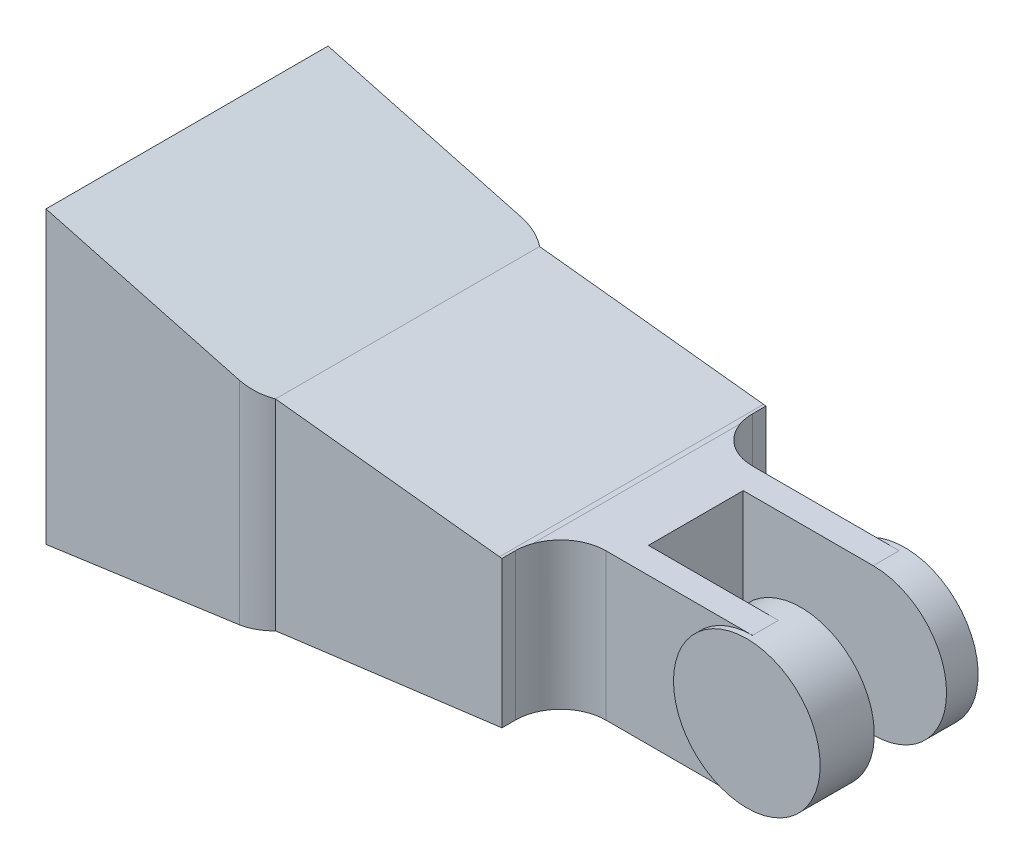
ISO-10303-21;
HEADER;
FILE_DESCRIPTION(('STEP AP214'),'2;1');
FILE_NAME('part.step','',(''),(''),'','','');
FILE_SCHEMA(('AUTOMOTIVE_DESIGN { 1 0 10303 214 1 1 1 1 }'));
ENDSEC;
DATA;
#1=APPLICATION_CONTEXT('core data for automotive mechanical design processes');
#2=APPLICATION_PROTOCOL_DEFINITION('international standard','automotive_design',2000,#1);
#3=PRODUCT_CONTEXT('',#1,'mechanical');
#4=PRODUCT('Part','Part','',(#3));
#5=PRODUCT_RELATED_PRODUCT_CATEGORY('part','',(#4));
#6=PRODUCT_DEFINITION_FORMATION('','',#4);
#7=PRODUCT_DEFINITION_CONTEXT('part definition',#1,'design');
#8=PRODUCT_DEFINITION('design','',#6,#7);
#9=PRODUCT_DEFINITION_SHAPE('','',#8);
#10=(LENGTH_UNIT() NAMED_UNIT(*) SI_UNIT(.MILLI.,.METRE.));
#11=(NAMED_UNIT(*) PLANE_ANGLE_UNIT() SI_UNIT($,.RADIAN.));
#12=(NAMED_UNIT(*) SI_UNIT($,.STERADIAN.) SOLID_ANGLE_UNIT());
#13=UNCERTAINTY_MEASURE_WITH_UNIT(LENGTH_MEASURE(1.E-05),#10,'distance_accuracy_value','');
#14=(GEOMETRIC_REPRESENTATION_CONTEXT(3) GLOBAL_UNCERTAINTY_ASSIGNED_CONTEXT((#13)) GLOBAL_UNIT_ASSIGNED_CONTEXT((#10,
#11,#12)) REPRESENTATION_CONTEXT('',''));
#15=CARTESIAN_POINT('',(0.,0.,0.));
#16=DIRECTION('',(0.,0.,1.));
#17=DIRECTION('',(1.,0.,0.));
#18=AXIS2_PLACEMENT_3D('',#15,#16,#17);
#19=CARTESIAN_POINT('',(782.433555688599,-126.351294856584,42.));
#20=DIRECTION('',(0.,0.,1.));
#21=DIRECTION('',(1.,0.,0.));
#22=AXIS2_PLACEMENT_3D('',#19,#20,#21);
#23=PLANE('',#22);
#24=CARTESIAN_POINT('',(566.102847064658,-21.3512948565843,42.));
#25=DIRECTION('',(0.,0.,1.));
#26=DIRECTION('',(1.,0.,0.));
#27=AXIS2_PLACEMENT_3D('',#24,#25,#26);
#28=CIRCLE('',#27,65.);
#29=CARTESIAN_POINT('',(566.102847064658,-86.3512948565843,42.));
#30=VERTEX_POINT('',#29);
#31=CARTESIAN_POINT('',(566.102847064658,43.6487051434157,42.));
#32=VERTEX_POINT('',#31);
#33=EDGE_CURVE('E11',#30,#32,#28,.F.);
#34=ORIENTED_EDGE('',*,*,#33,.F.);
#35=DIRECTION('',(1.,0.,0.));
#36=VECTOR('',#35,1.);
#37=CARTESIAN_POINT('',(566.102847064658,-86.3512948565843,42.));
#38=LINE('',#37,#36);
#39=CARTESIAN_POINT('',(450.918960223876,-86.3512948565843,42.));
#40=VERTEX_POINT('',#39);
#41=EDGE_CURVE('E177',#40,#30,#38,.T.);
#42=ORIENTED_EDGE('',*,*,#41,.F.);
#43=DIRECTION('',(0.,1.,0.));
#44=VECTOR('',#43,1.);
#45=CARTESIAN_POINT('',(450.918960223876,-126.351294856584,42.));
#46=LINE('',#45,#44);
#47=CARTESIAN_POINT('',(450.918960223876,43.6487051434157,42.));
#48=VERTEX_POINT('',#47);
#49=EDGE_CURVE('E459',#40,#48,#46,.T.);
#50=ORIENTED_EDGE('',*,*,#49,.T.);
#51=DIRECTION('',(1.,0.,0.));
#52=VECTOR('',#51,1.);
#53=CARTESIAN_POINT('',(782.433555688599,43.6487051434157,42.));
#54=LINE('',#53,#52);
#55=EDGE_CURVE('E180',#48,#32,#54,.T.);
#56=ORIENTED_EDGE('',*,*,#55,.T.);
#57=EDGE_LOOP('',(#34,#42,#50,#56));
#58=FACE_BOUND('',#57,.T.);
#59=ADVANCED_FACE('F38',(#58),#23,.F.);
#60=CARTESIAN_POINT('',(566.102847064658,-21.3512948565843,65.));
#61=DIRECTION('',(0.,0.,-1.));
#62=DIRECTION('',(-1.,0.,0.));
#63=AXIS2_PLACEMENT_3D('',#60,#61,#62);
#64=CYLINDRICAL_SURFACE('',#63,65.);
#65=DIRECTION('',(0.,0.,-1.));
#66=VECTOR('',#65,1.);
#67=CARTESIAN_POINT('',(566.102847064658,-86.3512948565842,65.));
#68=LINE('',#67,#66);
#69=CARTESIAN_POINT('',(566.102847064658,-86.3512948565843,65.));
#70=VERTEX_POINT('',#69);
#71=EDGE_CURVE('E189',#70,#30,#68,.T.);
#72=ORIENTED_EDGE('',*,*,#71,.T.);
#73=ORIENTED_EDGE('',*,*,#33,.T.);
#74=DIRECTION('',(0.,0.,-1.));
#75=VECTOR('',#74,1.);
#76=CARTESIAN_POINT('',(566.102847064658,43.6487051434157,65.));
#77=LINE('',#76,#75);
#78=CARTESIAN_POINT('',(566.102847064658,43.6487051434157,65.));
#79=VERTEX_POINT('',#78);
#80=EDGE_CURVE('E204',#79,#32,#77,.T.);
#81=ORIENTED_EDGE('',*,*,#80,.F.);
#82=CARTESIAN_POINT('',(566.102847064658,-21.3512948565843,65.));
#83=DIRECTION('',(0.,0.,1.));
#84=DIRECTION('',(1.,0.,0.));
#85=AXIS2_PLACEMENT_3D('',#82,#83,#84);
#86=CIRCLE('',#85,65.);
#87=EDGE_CURVE('E198',#79,#70,#86,.T.);
#88=ORIENTED_EDGE('',*,*,#87,.T.);
#89=EDGE_LOOP('',(#72,#73,#81,#88));
#90=FACE_BOUND('',#89,.T.);
#91=CARTESIAN_POINT('',(566.102847064658,-21.3512948565843,70.));
#92=DIRECTION('',(0.,0.,1.));
#93=DIRECTION('',(1.,0.,0.));
#94=AXIS2_PLACEMENT_3D('',#91,#92,#93);
#95=CIRCLE('',#94,65.);
#96=CARTESIAN_POINT('',(631.102847064658,-21.3512948565843,70.));
#97=VERTEX_POINT('',#96);
#98=EDGE_CURVE('E467',#97,#97,#95,.T.);
#99=ORIENTED_EDGE('',*,*,#98,.F.);
#100=EDGE_LOOP('',(#99));
#101=FACE_BOUND('',#100,.T.);
#102=CARTESIAN_POINT('',(566.102847064658,-21.3512948565843,22.));
#103=DIRECTION('',(0.,0.,-1.));
#104=DIRECTION('',(-1.,0.,0.));
#105=AXIS2_PLACEMENT_3D('',#102,#103,#104);
#106=CIRCLE('',#105,65.);
#107=CARTESIAN_POINT('',(501.102847064658,-21.3512948565843,22.));
#108=VERTEX_POINT('',#107);
#109=EDGE_CURVE('E474',#108,#108,#106,.T.);
#110=ORIENTED_EDGE('',*,*,#109,.F.);
#111=EDGE_LOOP('',(#110));
#112=FACE_BOUND('',#111,.T.);
#113=ADVANCED_FACE('F196',(#90,#101,#112),#64,.T.);
#114=CARTESIAN_POINT('',(396.102847064658,43.6487051434157,117.));
#115=DIRECTION('',(-1.,0.,0.));
#116=DIRECTION('',(0.,0.,1.));
#117=AXIS2_PLACEMENT_3D('',#114,#115,#116);
#118=PLANE('',#117);
#119=DIRECTION('',(0.,0.,-1.));
#120=VECTOR('',#119,1.);
#121=CARTESIAN_POINT('',(396.102847064658,-86.3512948565843,117.));
#122=LINE('',#121,#120);
#123=CARTESIAN_POINT('',(396.102847064658,-86.3512948565843,117.));
#124=VERTEX_POINT('',#123);
#125=CARTESIAN_POINT('',(396.102847064658,-86.3512948565843,105.));
#126=VERTEX_POINT('',#125);
#127=EDGE_CURVE('E230',#124,#126,#122,.T.);
#128=ORIENTED_EDGE('',*,*,#127,.T.);
#129=DIRECTION('',(0.,-1.,0.));
#130=VECTOR('',#129,1.);
#131=CARTESIAN_POINT('',(396.102847064658,43.6487051434157,105.));
#132=LINE('',#131,#130);
#133=CARTESIAN_POINT('',(396.102847064658,43.709091576023,105.));
#134=VERTEX_POINT('',#133);
#135=EDGE_CURVE('E281',#126,#134,#132,.F.);
#136=ORIENTED_EDGE('',*,*,#135,.T.);
#137=DIRECTION('',(0.,0.,1.));
#138=VECTOR('',#137,1.);
#139=CARTESIAN_POINT('',(396.102847064658,43.709091576023,105.));
#140=LINE('',#139,#138);
#141=CARTESIAN_POINT('',(396.102847064658,43.709091576023,117.));
#142=VERTEX_POINT('',#141);
#143=EDGE_CURVE('E289',#134,#142,#140,.T.);
#144=ORIENTED_EDGE('',*,*,#143,.T.);
#145=DIRECTION('',(0.,1.,0.));
#146=VECTOR('',#145,1.);
#147=CARTESIAN_POINT('',(396.102847064658,43.6487051434157,117.));
#148=LINE('',#147,#146);
#149=EDGE_CURVE('E214',#124,#142,#148,.T.);
#150=ORIENTED_EDGE('',*,*,#149,.F.);
#151=EDGE_LOOP('',(#128,#136,#144,#150));
#152=FACE_BOUND('',#151,.T.);
#153=ADVANCED_FACE('F339',(#152),#118,.F.);
#154=CARTESIAN_POINT('',(195.420455752212,65.7614292035398,125.));
#155=DIRECTION('',(-0.257950706385254,-0.966158078719703,0.));
#156=DIRECTION('',(0.966158078719703,-0.257950706385254,0.));
#157=AXIS2_PLACEMENT_3D('',#154,#155,#156);
#158=PLANE('',#157);
#159=DIRECTION('',(0.,0.,-1.));
#160=VECTOR('',#159,1.);
#161=CARTESIAN_POINT('',(195.420455752212,65.7614292035398,117.));
#162=LINE('',#161,#160);
#163=CARTESIAN_POINT('',(195.420455752212,65.7614292035398,117.));
#164=VERTEX_POINT('',#163);
#165=CARTESIAN_POINT('',(195.420455752212,65.7614292035398,-117.));
#166=VERTEX_POINT('',#165);
#167=EDGE_CURVE('E218',#164,#166,#162,.T.);
#168=ORIENTED_EDGE('',*,*,#167,.T.);
#169=CARTESIAN_POINT('',(171.420455752212,72.1690938389686,-85.));
#170=DIRECTION('',(-0.257950706385254,-0.966158078719703,0.));
#171=DIRECTION('',(0.966158078719703,-0.257950706385254,0.));
#172=AXIS2_PLACEMENT_3D('',#169,#170,#171);
#173=ELLIPSE('',#172,41.4010925137692,40.);
#174=CARTESIAN_POINT('',(171.420455752212,72.1690938389686,-125.));
#175=VERTEX_POINT('',#174);
#176=EDGE_CURVE('E258',#166,#175,#173,.F.);
#177=ORIENTED_EDGE('',*,*,#176,.T.);
#178=DIRECTION('',(-0.966158078719703,0.257950706385254,0.));
#179=VECTOR('',#178,1.);
#180=CARTESIAN_POINT('',(195.420455752212,65.7614292035398,-125.));
#181=LINE('',#180,#179);
#182=CARTESIAN_POINT('',(0.,117.935960176991,-125.));
#183=VERTEX_POINT('',#182);
#184=EDGE_CURVE('E235',#175,#183,#181,.T.);
#185=ORIENTED_EDGE('',*,*,#184,.T.);
#186=DIRECTION('',(0.,0.,-1.));
#187=VECTOR('',#186,1.);
#188=CARTESIAN_POINT('',(0.,117.935960176991,125.));
#189=LINE('',#188,#187);
#190=CARTESIAN_POINT('',(0.,117.935960176991,125.));
#191=VERTEX_POINT('',#190);
#192=EDGE_CURVE('E252',#191,#183,#189,.T.);
#193=ORIENTED_EDGE('',*,*,#192,.F.);
#194=DIRECTION('',(-0.966158078719703,0.257950706385254,0.));
#195=VECTOR('',#194,1.);
#196=CARTESIAN_POINT('',(195.420455752212,65.7614292035398,125.));
#197=LINE('',#196,#195);
#198=CARTESIAN_POINT('',(171.420455752212,72.1690938389686,125.));
#199=VERTEX_POINT('',#198);
#200=EDGE_CURVE('E236',#199,#191,#197,.T.);
#201=ORIENTED_EDGE('',*,*,#200,.F.);
#202=CARTESIAN_POINT('',(171.420455752212,72.1690938389686,85.));
#203=DIRECTION('',(-0.257950706385254,-0.966158078719703,0.));
#204=DIRECTION('',(0.966158078719703,-0.257950706385254,0.));
#205=AXIS2_PLACEMENT_3D('',#202,#203,#204);
#206=ELLIPSE('',#205,41.4010925137692,40.);
#207=EDGE_CURVE('E255',#199,#164,#206,.F.);
#208=ORIENTED_EDGE('',*,*,#207,.T.);
#209=EDGE_LOOP('',(#168,#177,#185,#193,#201,#208));
#210=FACE_BOUND('',#209,.T.);
#211=ADVANCED_FACE('F400',(#210),#158,.F.);
#212=CARTESIAN_POINT('',(0.,117.935960176991,125.));
#213=DIRECTION('',(1.,0.,0.));
#214=DIRECTION('',(0.,0.,-1.));
#215=AXIS2_PLACEMENT_3D('',#212,#213,#214);
#216=PLANE('',#215);
#217=DIRECTION('',(0.,-1.,0.));
#218=VECTOR('',#217,1.);
#219=CARTESIAN_POINT('',(0.,117.935960176991,-125.));
#220=LINE('',#219,#218);
#221=CARTESIAN_POINT('',(0.,-139.586039823009,-125.));
#222=VERTEX_POINT('',#221);
#223=EDGE_CURVE('E246',#183,#222,#220,.T.);
#224=ORIENTED_EDGE('',*,*,#223,.T.);
#225=DIRECTION('',(0.,0.,-1.));
#226=VECTOR('',#225,1.);
#227=CARTESIAN_POINT('',(0.,-139.586039823009,125.));
#228=LINE('',#227,#226);
#229=CARTESIAN_POINT('',(0.,-139.586039823009,125.));
#230=VERTEX_POINT('',#229);
#231=EDGE_CURVE('E244',#230,#222,#228,.T.);
#232=ORIENTED_EDGE('',*,*,#231,.F.);
#233=DIRECTION('',(0.,-1.,0.));
#234=VECTOR('',#233,1.);
#235=CARTESIAN_POINT('',(0.,117.935960176991,125.));
#236=LINE('',#235,#234);
#237=EDGE_CURVE('E238',#191,#230,#236,.T.);
#238=ORIENTED_EDGE('',*,*,#237,.F.);
#239=ORIENTED_EDGE('',*,*,#192,.T.);
#240=EDGE_LOOP('',(#224,#232,#238,#239));
#241=FACE_BOUND('',#240,.T.);
#242=ADVANCED_FACE('F396',(#241),#216,.F.);
#243=CARTESIAN_POINT('',(0.,-139.586039823009,125.));
#244=DIRECTION('',(-0.138591208041807,0.990349674132078,0.));
#245=DIRECTION('',(-0.990349674132078,-0.138591208041807,0.));
#246=AXIS2_PLACEMENT_3D('',#243,#244,#245);
#247=PLANE('',#246);
#248=DIRECTION('',(0.990349674132078,0.138591208041807,0.));
#249=VECTOR('',#248,1.);
#250=CARTESIAN_POINT('',(0.,-139.586039823009,-125.));
#251=LINE('',#250,#249);
#252=CARTESIAN_POINT('',(171.420455752212,-115.597171379551,-125.));
#253=VERTEX_POINT('',#252);
#254=EDGE_CURVE('E239',#222,#253,#251,.T.);
#255=ORIENTED_EDGE('',*,*,#254,.T.);
#256=CARTESIAN_POINT('',(171.420455752212,-115.597171379551,-85.));
#257=DIRECTION('',(-0.138591208041807,0.990349674132078,0.));
#258=DIRECTION('',(-0.990349674132078,-0.138591208041807,0.));
#259=AXIS2_PLACEMENT_3D('',#256,#257,#258);
#260=ELLIPSE('',#259,40.3897744855171,40.);
#261=CARTESIAN_POINT('',(195.420455752212,-112.23857079646,-117.));
#262=VERTEX_POINT('',#261);
#263=EDGE_CURVE('E264',#253,#262,#260,.F.);
#264=ORIENTED_EDGE('',*,*,#263,.T.);
#265=DIRECTION('',(0.,0.,-1.));
#266=VECTOR('',#265,1.);
#267=CARTESIAN_POINT('',(195.420455752212,-112.23857079646,117.));
#268=LINE('',#267,#266);
#269=CARTESIAN_POINT('',(195.420455752212,-112.23857079646,117.));
#270=VERTEX_POINT('',#269);
#271=EDGE_CURVE('E232',#270,#262,#268,.T.);
#272=ORIENTED_EDGE('',*,*,#271,.F.);
#273=CARTESIAN_POINT('',(171.420455752212,-115.597171379551,85.));
#274=DIRECTION('',(-0.138591208041807,0.990349674132078,0.));
#275=DIRECTION('',(-0.990349674132078,-0.138591208041807,0.));
#276=AXIS2_PLACEMENT_3D('',#273,#274,#275);
#277=ELLIPSE('',#276,40.3897744855171,40.);
#278=CARTESIAN_POINT('',(171.420455752212,-115.597171379551,125.));
#279=VERTEX_POINT('',#278);
#280=EDGE_CURVE('E262',#270,#279,#277,.F.);
#281=ORIENTED_EDGE('',*,*,#280,.T.);
#282=DIRECTION('',(0.990349674132078,0.138591208041807,0.));
#283=VECTOR('',#282,1.);
#284=CARTESIAN_POINT('',(0.,-139.586039823009,125.));
#285=LINE('',#284,#283);
#286=EDGE_CURVE('E241',#230,#279,#285,.T.);
#287=ORIENTED_EDGE('',*,*,#286,.F.);
#288=ORIENTED_EDGE('',*,*,#231,.T.);
#289=EDGE_LOOP('',(#255,#264,#272,#281,#287,#288));
#290=FACE_BOUND('',#289,.T.);
#291=ADVANCED_FACE('F389',(#290),#247,.F.);
#292=CARTESIAN_POINT('',(0.,0.,125.));
#293=DIRECTION('',(0.,0.,1.));
#294=DIRECTION('',(1.,0.,0.));
#295=AXIS2_PLACEMENT_3D('',#292,#293,#294);
#296=PLANE('',#295);
#297=ORIENTED_EDGE('',*,*,#286,.T.);
#298=DIRECTION('',(0.,1.,0.));
#299=VECTOR('',#298,1.);
#300=CARTESIAN_POINT('',(171.420455752212,65.7614292035398,125.));
#301=LINE('',#300,#299);
#302=EDGE_CURVE('E266',#279,#199,#301,.T.);
#303=ORIENTED_EDGE('',*,*,#302,.T.);
#304=ORIENTED_EDGE('',*,*,#200,.T.);
#305=ORIENTED_EDGE('',*,*,#237,.T.);
#306=EDGE_LOOP('',(#297,#303,#304,#305));
#307=FACE_BOUND('',#306,.T.);
#308=ADVANCED_FACE('F386',(#307),#296,.T.);
#309=CARTESIAN_POINT('',(0.,0.,-125.));
#310=DIRECTION('',(0.,0.,1.));
#311=DIRECTION('',(1.,0.,0.));
#312=AXIS2_PLACEMENT_3D('',#309,#310,#311);
#313=PLANE('',#312);
#314=ORIENTED_EDGE('',*,*,#184,.F.);
#315=DIRECTION('',(0.,-1.,0.));
#316=VECTOR('',#315,1.);
#317=CARTESIAN_POINT('',(171.420455752212,0.,-125.));
#318=LINE('',#317,#316);
#319=EDGE_CURVE('E260',#175,#253,#318,.T.);
#320=ORIENTED_EDGE('',*,*,#319,.T.);
#321=ORIENTED_EDGE('',*,*,#254,.F.);
#322=ORIENTED_EDGE('',*,*,#223,.F.);
#323=EDGE_LOOP('',(#314,#320,#321,#322));
#324=FACE_BOUND('',#323,.T.);
#325=ADVANCED_FACE('F385',(#324),#313,.F.);
#326=CARTESIAN_POINT('',(396.102847064658,-86.3512948565843,117.));
#327=DIRECTION('',(-0.127936210326405,0.99178239855692,0.));
#328=DIRECTION('',(-0.99178239855692,-0.127936210326405,0.));
#329=AXIS2_PLACEMENT_3D('',#326,#327,#328);
#330=PLANE('',#329);
#331=DIRECTION('',(0.99178239855692,0.127936210326405,0.));
#332=VECTOR('',#331,1.);
#333=CARTESIAN_POINT('',(396.102847064658,-86.3512948565843,-117.));
#334=LINE('',#333,#332);
#335=CARTESIAN_POINT('',(396.102847064658,-86.3512948565843,-117.));
#336=VERTEX_POINT('',#335);
#337=EDGE_CURVE('E221',#262,#336,#334,.T.);
#338=ORIENTED_EDGE('',*,*,#337,.T.);
#339=CARTESIAN_POINT('',(396.102847064658,-86.3512948565843,-105.));
#340=VERTEX_POINT('',#339);
#341=EDGE_CURVE('E229',#340,#336,#122,.T.);
#342=ORIENTED_EDGE('',*,*,#341,.F.);
#343=DIRECTION('',(0.,0.,-1.));
#344=VECTOR('',#343,1.);
#345=CARTESIAN_POINT('',(396.102847064658,-86.3512948565843,65.));
#346=LINE('',#345,#344);
#347=EDGE_CURVE('E62',#126,#340,#346,.T.);
#348=ORIENTED_EDGE('',*,*,#347,.F.);
#349=ORIENTED_EDGE('',*,*,#127,.F.);
#350=DIRECTION('',(0.99178239855692,0.127936210326405,0.));
#351=VECTOR('',#350,1.);
#352=CARTESIAN_POINT('',(396.102847064658,-86.3512948565843,117.));
#353=LINE('',#352,#351);
#354=EDGE_CURVE('E211',#270,#124,#353,.T.);
#355=ORIENTED_EDGE('',*,*,#354,.F.);
#356=ORIENTED_EDGE('',*,*,#271,.T.);
#357=EDGE_LOOP('',(#338,#342,#348,#349,#355,#356));
#358=FACE_BOUND('',#357,.T.);
#359=ADVANCED_FACE('F381',(#358),#330,.F.);
#360=DIRECTION('',(0.,0.,1.));
#361=VECTOR('',#360,1.);
#362=CARTESIAN_POINT('',(396.102847064658,43.709091576023,-117.));
#363=LINE('',#362,#361);
#364=CARTESIAN_POINT('',(396.102847064658,43.709091576023,-117.));
#365=VERTEX_POINT('',#364);
#366=CARTESIAN_POINT('',(396.102847064658,43.709091576023,-105.));
#367=VERTEX_POINT('',#366);
#368=EDGE_CURVE('E286',#365,#367,#363,.T.);
#369=ORIENTED_EDGE('',*,*,#368,.T.);
#370=DIRECTION('',(0.,-1.,0.));
#371=VECTOR('',#370,1.);
#372=CARTESIAN_POINT('',(396.102847064658,43.6487051434157,-105.));
#373=LINE('',#372,#371);
#374=EDGE_CURVE('E274',#367,#340,#373,.T.);
#375=ORIENTED_EDGE('',*,*,#374,.T.);
#376=ORIENTED_EDGE('',*,*,#341,.T.);
#377=DIRECTION('',(0.,1.,0.));
#378=VECTOR('',#377,1.);
#379=CARTESIAN_POINT('',(396.102847064658,43.6487051434157,-117.));
#380=LINE('',#379,#378);
#381=EDGE_CURVE('E224',#336,#365,#380,.T.);
#382=ORIENTED_EDGE('',*,*,#381,.T.);
#383=EDGE_LOOP('',(#369,#375,#376,#382));
#384=FACE_BOUND('',#383,.T.);
#385=ADVANCED_FACE('F377',(#384),#118,.F.);
#386=CARTESIAN_POINT('',(195.420455752212,65.7614292035398,117.));
#387=DIRECTION('',(-0.109524782970096,-0.99398406522205,0.));
#388=DIRECTION('',(0.993984065222051,-0.109524782970096,0.));
#389=AXIS2_PLACEMENT_3D('',#386,#387,#388);
#390=PLANE('',#389);
#391=DIRECTION('',(-0.99398406522205,0.109524782970096,0.));
#392=VECTOR('',#391,1.);
#393=CARTESIAN_POINT('',(195.420455752212,65.7614292035398,117.));
#394=LINE('',#393,#392);
#395=CARTESIAN_POINT('',(393.918960223876,43.8893425345337,117.));
#396=VERTEX_POINT('',#395);
#397=EDGE_CURVE('E216',#396,#164,#394,.T.);
#398=ORIENTED_EDGE('',*,*,#397,.F.);
#399=DIRECTION('',(0.,0.,-1.));
#400=VECTOR('',#399,1.);
#401=CARTESIAN_POINT('',(393.918960223876,43.8893425345337,-64.9999999999999));
#402=LINE('',#401,#400);
#403=CARTESIAN_POINT('',(393.918960223876,43.8893425345337,-117.));
#404=VERTEX_POINT('',#403);
#405=EDGE_CURVE('E269',#396,#404,#402,.T.);
#406=ORIENTED_EDGE('',*,*,#405,.T.);
#407=DIRECTION('',(-0.99398406522205,0.109524782970096,0.));
#408=VECTOR('',#407,1.);
#409=CARTESIAN_POINT('',(195.420455752212,65.7614292035398,-117.));
#410=LINE('',#409,#408);
#411=EDGE_CURVE('E212',#404,#166,#410,.T.);
#412=ORIENTED_EDGE('',*,*,#411,.T.);
#413=ORIENTED_EDGE('',*,*,#167,.F.);
#414=EDGE_LOOP('',(#398,#406,#412,#413));
#415=FACE_BOUND('',#414,.T.);
#416=ADVANCED_FACE('F369',(#415),#390,.F.);
#417=CARTESIAN_POINT('',(0.,0.,117.));
#418=DIRECTION('',(0.,0.,-1.));
#419=DIRECTION('',(-1.,0.,0.));
#420=AXIS2_PLACEMENT_3D('',#417,#418,#419);
#421=PLANE('',#420);
#422=DIRECTION('',(0.,-1.,0.));
#423=VECTOR('',#422,1.);
#424=CARTESIAN_POINT('',(195.420455752212,-112.23857079646,117.));
#425=LINE('',#424,#423);
#426=EDGE_CURVE('E208',#164,#270,#425,.T.);
#427=ORIENTED_EDGE('',*,*,#426,.T.);
#428=ORIENTED_EDGE('',*,*,#354,.T.);
#429=ORIENTED_EDGE('',*,*,#149,.T.);
#430=CARTESIAN_POINT('',(398.29995154268,83.6487051434157,117.));
#431=DIRECTION('',(0.,0.,-1.));
#432=DIRECTION('',(-1.,0.,0.));
#433=AXIS2_PLACEMENT_3D('',#430,#431,#432);
#434=CIRCLE('',#433,40.);
#435=EDGE_CURVE('E292',#142,#396,#434,.T.);
#436=ORIENTED_EDGE('',*,*,#435,.T.);
#437=ORIENTED_EDGE('',*,*,#397,.T.);
#438=EDGE_LOOP('',(#427,#428,#429,#436,#437));
#439=FACE_BOUND('',#438,.T.);
#440=ADVANCED_FACE('F365',(#439),#421,.F.);
#441=CARTESIAN_POINT('',(0.,0.,-117.));
#442=DIRECTION('',(0.,0.,-1.));
#443=DIRECTION('',(-1.,0.,0.));
#444=AXIS2_PLACEMENT_3D('',#441,#442,#443);
#445=PLANE('',#444);
#446=DIRECTION('',(0.,-1.,0.));
#447=VECTOR('',#446,1.);
#448=CARTESIAN_POINT('',(195.420455752212,-112.23857079646,-117.));
#449=LINE('',#448,#447);
#450=EDGE_CURVE('E201',#166,#262,#449,.T.);
#451=ORIENTED_EDGE('',*,*,#450,.F.);
#452=ORIENTED_EDGE('',*,*,#411,.F.);
#453=CARTESIAN_POINT('',(398.29995154268,83.6487051434157,-117.));
#454=DIRECTION('',(0.,0.,-1.));
#455=DIRECTION('',(-1.,0.,0.));
#456=AXIS2_PLACEMENT_3D('',#453,#454,#455);
#457=CIRCLE('',#456,40.);
#458=EDGE_CURVE('E283',#404,#365,#457,.F.);
#459=ORIENTED_EDGE('',*,*,#458,.T.);
#460=ORIENTED_EDGE('',*,*,#381,.F.);
#461=ORIENTED_EDGE('',*,*,#337,.F.);
#462=EDGE_LOOP('',(#451,#452,#459,#460,#461));
#463=FACE_BOUND('',#462,.T.);
#464=ADVANCED_FACE('F368',(#463),#445,.T.);
#465=CARTESIAN_POINT('',(171.420455752212,-112.23857079646,-85.));
#466=DIRECTION('',(0.,-1.,0.));
#467=DIRECTION('',(0.,0.,-1.));
#468=AXIS2_PLACEMENT_3D('',#465,#466,#467);
#469=CYLINDRICAL_SURFACE('',#468,40.);
#470=ORIENTED_EDGE('',*,*,#263,.F.);
#471=ORIENTED_EDGE('',*,*,#319,.F.);
#472=ORIENTED_EDGE('',*,*,#176,.F.);
#473=ORIENTED_EDGE('',*,*,#450,.T.);
#474=EDGE_LOOP('',(#470,#471,#472,#473));
#475=FACE_BOUND('',#474,.T.);
#476=ADVANCED_FACE('F373',(#475),#469,.T.);
#477=CARTESIAN_POINT('',(171.420455752212,-112.23857079646,85.));
#478=DIRECTION('',(0.,-1.,0.));
#479=DIRECTION('',(0.,0.,-1.));
#480=AXIS2_PLACEMENT_3D('',#477,#478,#479);
#481=CYLINDRICAL_SURFACE('',#480,40.);
#482=ORIENTED_EDGE('',*,*,#280,.F.);
#483=ORIENTED_EDGE('',*,*,#426,.F.);
#484=ORIENTED_EDGE('',*,*,#207,.F.);
#485=ORIENTED_EDGE('',*,*,#302,.F.);
#486=EDGE_LOOP('',(#482,#483,#484,#485));
#487=FACE_BOUND('',#486,.T.);
#488=ADVANCED_FACE('F364',(#487),#481,.T.);
#489=CARTESIAN_POINT('',(566.102847064658,-86.3512948565843,65.));
#490=DIRECTION('',(0.,1.,0.));
#491=DIRECTION('',(-1.,0.,0.));
#492=AXIS2_PLACEMENT_3D('',#489,#490,#491);
#493=PLANE('',#492);
#494=DIRECTION('',(0.,0.,1.));
#495=VECTOR('',#494,1.);
#496=CARTESIAN_POINT('',(450.918960223876,-86.3512948565843,65.));
#497=LINE('',#496,#495);
#498=CARTESIAN_POINT('',(450.918960223876,-86.3512948565843,-42.));
#499=VERTEX_POINT('',#498);
#500=EDGE_CURVE('E192',#499,#40,#497,.T.);
#501=ORIENTED_EDGE('',*,*,#500,.T.);
#502=ORIENTED_EDGE('',*,*,#41,.T.);
#503=ORIENTED_EDGE('',*,*,#71,.F.);
#504=DIRECTION('',(1.,0.,0.));
#505=VECTOR('',#504,1.);
#506=CARTESIAN_POINT('',(566.102847064658,-86.3512948565843,65.));
#507=LINE('',#506,#505);
#508=CARTESIAN_POINT('',(436.102847064658,-86.3512948565843,65.));
#509=VERTEX_POINT('',#508);
#510=EDGE_CURVE('E448',#509,#70,#507,.T.);
#511=ORIENTED_EDGE('',*,*,#510,.F.);
#512=CARTESIAN_POINT('',(436.102847064658,-86.3512948565843,105.));
#513=DIRECTION('',(0.,1.,0.));
#514=DIRECTION('',(-1.,0.,0.));
#515=AXIS2_PLACEMENT_3D('',#512,#513,#514);
#516=CIRCLE('',#515,40.);
#517=EDGE_CURVE('E299',#509,#126,#516,.T.);
#518=ORIENTED_EDGE('',*,*,#517,.T.);
#519=ORIENTED_EDGE('',*,*,#347,.T.);
#520=CARTESIAN_POINT('',(436.102847064658,-86.3512948565843,-105.));
#521=DIRECTION('',(0.,1.,0.));
#522=DIRECTION('',(-1.,0.,0.));
#523=AXIS2_PLACEMENT_3D('',#520,#521,#522);
#524=CIRCLE('',#523,40.);
#525=CARTESIAN_POINT('',(436.102847064658,-86.3512948565843,-65.));
#526=VERTEX_POINT('',#525);
#527=EDGE_CURVE('E294',#340,#526,#524,.T.);
#528=ORIENTED_EDGE('',*,*,#527,.T.);
#529=DIRECTION('',(1.,0.,0.));
#530=VECTOR('',#529,1.);
#531=CARTESIAN_POINT('',(566.102847064658,-86.3512948565843,-65.));
#532=LINE('',#531,#530);
#533=CARTESIAN_POINT('',(566.102847064658,-86.3512948565842,-65.));
#534=VERTEX_POINT('',#533);
#535=EDGE_CURVE('E443',#526,#534,#532,.T.);
#536=ORIENTED_EDGE('',*,*,#535,.T.);
#537=CARTESIAN_POINT('',(566.102847064658,-86.3512948565842,-42.));
#538=VERTEX_POINT('',#537);
#539=EDGE_CURVE('E199',#538,#534,#68,.T.);
#540=ORIENTED_EDGE('',*,*,#539,.F.);
#541=DIRECTION('',(-1.,0.,0.));
#542=VECTOR('',#541,1.);
#543=CARTESIAN_POINT('',(566.102847064658,-86.3512948565843,-42.));
#544=LINE('',#543,#542);
#545=EDGE_CURVE('E456',#538,#499,#544,.T.);
#546=ORIENTED_EDGE('',*,*,#545,.T.);
#547=EDGE_LOOP('',(#501,#502,#503,#511,#518,#519,#528,#536,#540,#546));
#548=FACE_BOUND('',#547,.T.);
#549=ADVANCED_FACE('F187',(#548),#493,.F.);
#550=CARTESIAN_POINT('',(566.102847064658,43.6487051434157,-42.));
#551=VERTEX_POINT('',#550);
#552=CARTESIAN_POINT('',(566.102847064658,43.6487051434158,-65.));
#553=VERTEX_POINT('',#552);
#554=EDGE_CURVE('E453',#551,#553,#77,.T.);
#555=ORIENTED_EDGE('',*,*,#554,.F.);
#556=CARTESIAN_POINT('',(566.102847064658,-21.3512948565843,-42.));
#557=DIRECTION('',(0.,0.,-1.));
#558=DIRECTION('',(-1.,0.,0.));
#559=AXIS2_PLACEMENT_3D('',#556,#557,#558);
#560=CIRCLE('',#559,65.);
#561=EDGE_CURVE('E54',#551,#538,#560,.T.);
#562=ORIENTED_EDGE('',*,*,#561,.T.);
#563=ORIENTED_EDGE('',*,*,#539,.T.);
#564=CARTESIAN_POINT('',(566.102847064658,-21.3512948565843,-65.));
#565=DIRECTION('',(0.,0.,-1.));
#566=DIRECTION('',(-1.,0.,0.));
#567=AXIS2_PLACEMENT_3D('',#564,#565,#566);
#568=CIRCLE('',#567,65.);
#569=EDGE_CURVE('E47',#553,#534,#568,.F.);
#570=ORIENTED_EDGE('',*,*,#569,.F.);
#571=EDGE_LOOP('',(#555,#562,#563,#570));
#572=FACE_BOUND('',#571,.T.);
#573=CARTESIAN_POINT('',(566.102847064658,-21.3512948565843,-70.));
#574=DIRECTION('',(0.,0.,-1.));
#575=DIRECTION('',(-1.,0.,0.));
#576=AXIS2_PLACEMENT_3D('',#573,#574,#575);
#577=CIRCLE('',#576,65.);
#578=CARTESIAN_POINT('',(501.102847064658,-21.3512948565843,-70.));
#579=VERTEX_POINT('',#578);
#580=EDGE_CURVE('E469',#579,#579,#577,.T.);
#581=ORIENTED_EDGE('',*,*,#580,.F.);
#582=EDGE_LOOP('',(#581));
#583=FACE_BOUND('',#582,.T.);
#584=ADVANCED_FACE('F341',(#572,#583),#64,.T.);
#585=CARTESIAN_POINT('',(396.102847064658,43.6487051434157,65.));
#586=DIRECTION('',(0.,-1.,0.));
#587=DIRECTION('',(0.,0.,-1.));
#588=AXIS2_PLACEMENT_3D('',#585,#586,#587);
#589=PLANE('',#588);
#590=ORIENTED_EDGE('',*,*,#80,.T.);
#591=ORIENTED_EDGE('',*,*,#55,.F.);
#592=DIRECTION('',(0.,0.,1.));
#593=VECTOR('',#592,1.);
#594=CARTESIAN_POINT('',(450.918960223876,43.6487051434157,-42.));
#595=LINE('',#594,#593);
#596=CARTESIAN_POINT('',(450.918960223876,43.6487051434157,-42.));
#597=VERTEX_POINT('',#596);
#598=EDGE_CURVE('E464',#597,#48,#595,.T.);
#599=ORIENTED_EDGE('',*,*,#598,.F.);
#600=DIRECTION('',(1.,0.,0.));
#601=VECTOR('',#600,1.);
#602=CARTESIAN_POINT('',(396.102847064658,43.6487051434157,-42.));
#603=LINE('',#602,#601);
#604=EDGE_CURVE('E304',#597,#551,#603,.T.);
#605=ORIENTED_EDGE('',*,*,#604,.T.);
#606=ORIENTED_EDGE('',*,*,#554,.T.);
#607=DIRECTION('',(-1.,0.,0.));
#608=VECTOR('',#607,1.);
#609=CARTESIAN_POINT('',(396.102847064658,43.6487051434157,-65.));
#610=LINE('',#609,#608);
#611=CARTESIAN_POINT('',(436.102847064658,43.6487051434157,-65.));
#612=VERTEX_POINT('',#611);
#613=EDGE_CURVE('E446',#553,#612,#610,.T.);
#614=ORIENTED_EDGE('',*,*,#613,.T.);
#615=CARTESIAN_POINT('',(436.102847064658,43.6487051434157,-105.));
#616=DIRECTION('',(0.,-1.,0.));
#617=DIRECTION('',(0.,0.,-1.));
#618=AXIS2_PLACEMENT_3D('',#615,#616,#617);
#619=CIRCLE('',#618,40.);
#620=CARTESIAN_POINT('',(398.29995154268,43.6487051434157,-91.9255558376503));
#621=VERTEX_POINT('',#620);
#622=EDGE_CURVE('E296',#612,#621,#619,.T.);
#623=ORIENTED_EDGE('',*,*,#622,.T.);
#624=DIRECTION('',(0.,0.,-1.));
#625=VECTOR('',#624,1.);
#626=CARTESIAN_POINT('',(398.29995154268,43.6487051434157,65.));
#627=LINE('',#626,#625);
#628=CARTESIAN_POINT('',(398.29995154268,43.6487051434157,91.9255558376503));
#629=VERTEX_POINT('',#628);
#630=EDGE_CURVE('E272',#621,#629,#627,.F.);
#631=ORIENTED_EDGE('',*,*,#630,.T.);
#632=CARTESIAN_POINT('',(436.102847064658,43.6487051434157,105.));
#633=DIRECTION('',(0.,-1.,0.));
#634=DIRECTION('',(0.,0.,-1.));
#635=AXIS2_PLACEMENT_3D('',#632,#633,#634);
#636=CIRCLE('',#635,40.);
#637=CARTESIAN_POINT('',(436.102847064658,43.6487051434157,65.));
#638=VERTEX_POINT('',#637);
#639=EDGE_CURVE('E302',#629,#638,#636,.T.);
#640=ORIENTED_EDGE('',*,*,#639,.T.);
#641=DIRECTION('',(-1.,0.,0.));
#642=VECTOR('',#641,1.);
#643=CARTESIAN_POINT('',(396.102847064658,43.6487051434157,65.));
#644=LINE('',#643,#642);
#645=EDGE_CURVE('E450',#79,#638,#644,.T.);
#646=ORIENTED_EDGE('',*,*,#645,.F.);
#647=EDGE_LOOP('',(#590,#591,#599,#605,#606,#614,#623,#631,#640,#646));
#648=FACE_BOUND('',#647,.T.);
#649=ADVANCED_FACE('F352',(#648),#589,.F.);
#650=CARTESIAN_POINT('',(566.102847064658,-21.3512948565843,65.));
#651=DIRECTION('',(0.,0.,-1.));
#652=DIRECTION('',(-1.,0.,0.));
#653=AXIS2_PLACEMENT_3D('',#650,#651,#652);
#654=PLANE('',#653);
#655=ORIENTED_EDGE('',*,*,#87,.F.);
#656=ORIENTED_EDGE('',*,*,#645,.T.);
#657=DIRECTION('',(0.,-1.,0.));
#658=VECTOR('',#657,1.);
#659=CARTESIAN_POINT('',(436.102847064658,-86.3512948565843,65.));
#660=LINE('',#659,#658);
#661=EDGE_CURVE('E279',#638,#509,#660,.T.);
#662=ORIENTED_EDGE('',*,*,#661,.T.);
#663=ORIENTED_EDGE('',*,*,#510,.T.);
#664=EDGE_LOOP('',(#655,#656,#662,#663));
#665=FACE_BOUND('',#664,.T.);
#666=ADVANCED_FACE('F348',(#665),#654,.F.);
#667=CARTESIAN_POINT('',(566.102847064658,-21.3512948565843,-65.));
#668=DIRECTION('',(0.,0.,-1.));
#669=DIRECTION('',(-1.,0.,0.));
#670=AXIS2_PLACEMENT_3D('',#667,#668,#669);
#671=PLANE('',#670);
#672=ORIENTED_EDGE('',*,*,#613,.F.);
#673=ORIENTED_EDGE('',*,*,#569,.T.);
#674=ORIENTED_EDGE('',*,*,#535,.F.);
#675=DIRECTION('',(0.,-1.,0.));
#676=VECTOR('',#675,1.);
#677=CARTESIAN_POINT('',(436.102847064658,-21.3512948565843,-65.));
#678=LINE('',#677,#676);
#679=EDGE_CURVE('E277',#526,#612,#678,.F.);
#680=ORIENTED_EDGE('',*,*,#679,.T.);
#681=EDGE_LOOP('',(#672,#673,#674,#680));
#682=FACE_BOUND('',#681,.T.);
#683=ADVANCED_FACE('F351',(#682),#671,.T.);
#684=CARTESIAN_POINT('',(436.102847064658,-21.3512948565843,105.));
#685=DIRECTION('',(0.,1.,0.));
#686=DIRECTION('',(0.,0.,1.));
#687=AXIS2_PLACEMENT_3D('',#684,#685,#686);
#688=CYLINDRICAL_SURFACE('',#687,40.);
#689=ORIENTED_EDGE('',*,*,#661,.F.);
#690=ORIENTED_EDGE('',*,*,#639,.F.);
#691=CARTESIAN_POINT('',(398.29995154268,43.6487051434157,91.9255558376503));
#692=CARTESIAN_POINT('',(398.117917204807,43.6487228827667,92.4518598155025));
#693=CARTESIAN_POINT('',(397.946888539037,43.6499484942173,92.9819671814736));
#694=CARTESIAN_POINT('',(397.62711131301,43.6540400470978,94.048848414237));
#695=CARTESIAN_POINT('',(397.478362533201,43.6569059723624,94.5856222152804));
#696=CARTESIAN_POINT('',(397.20435608964,43.6634800763026,95.6611936691028));
#697=CARTESIAN_POINT('',(397.078943846114,43.6671823245426,96.1999519891135));
#698=CARTESIAN_POINT('',(396.850567325467,43.6748090900965,97.282203673105));
#699=CARTESIAN_POINT('',(396.747603026058,43.6787336071897,97.8256970323841));
#700=CARTESIAN_POINT('',(396.564299204148,43.6862736726952,98.9164901848606));
#701=CARTESIAN_POINT('',(396.483959770989,43.6898892198876,99.4637899930804));
#702=CARTESIAN_POINT('',(396.346043650255,43.6963963312503,100.561255139031));
#703=CARTESIAN_POINT('',(396.288466991922,43.6992878944906,101.111420480442));
#704=CARTESIAN_POINT('',(396.195858912333,43.7040548634041,102.217487974595));
#705=CARTESIAN_POINT('',(396.16098639451,43.705923092771,102.773403469898));
#706=CARTESIAN_POINT('',(396.114476692508,43.7084525827957,103.88621249122));
#707=CARTESIAN_POINT('',(396.10283968805,43.7091138341178,104.443106024771));
#708=CARTESIAN_POINT('',(396.102847064658,43.709091576023,105.));
#709=B_SPLINE_CURVE_WITH_KNOTS('',3,(#691,#692,#693,#694,#695,#696,#697,#698,#699,#700,#701,
#702,#703,#704,#705,#706,#707,#708),.UNSPECIFIED.,.F.,.F.,(4,2,2,2,2,2,2,2,4),(0.,
1.67055936767412,3.34110227226128,5.00015169918129,6.65919947889143,8.31825380981391,
9.97731027206461,11.6478568760007,13.3184164011451),.UNSPECIFIED.);
#710=EDGE_CURVE('E311',#134,#629,#709,.F.);
#711=ORIENTED_EDGE('',*,*,#710,.F.);
#712=ORIENTED_EDGE('',*,*,#135,.F.);
#713=ORIENTED_EDGE('',*,*,#517,.F.);
#714=EDGE_LOOP('',(#689,#690,#711,#712,#713));
#715=FACE_BOUND('',#714,.T.);
#716=ADVANCED_FACE('F40',(#715),#688,.F.);
#717=CARTESIAN_POINT('',(436.102847064658,43.6487051434157,-105.));
#718=DIRECTION('',(0.,-1.,0.));
#719=DIRECTION('',(0.,0.,-1.));
#720=AXIS2_PLACEMENT_3D('',#717,#718,#719);
#721=CYLINDRICAL_SURFACE('',#720,40.);
#722=ORIENTED_EDGE('',*,*,#374,.F.);
#723=CARTESIAN_POINT('',(396.102847064658,43.709091576023,-105.));
#724=CARTESIAN_POINT('',(396.10283968805,43.7091138341178,-104.443106024771));
#725=CARTESIAN_POINT('',(396.114476692508,43.7084525827957,-103.88621249122));
#726=CARTESIAN_POINT('',(396.16098639451,43.705923092771,-102.773403469898));
#727=CARTESIAN_POINT('',(396.195858912333,43.7040548634041,-102.217487974595));
#728=CARTESIAN_POINT('',(396.288466991922,43.6992878944906,-101.111420480442));
#729=CARTESIAN_POINT('',(396.346043650255,43.6963963312503,-100.561255139031));
#730=CARTESIAN_POINT('',(396.483959770989,43.6898892198876,-99.4637899930804));
#731=CARTESIAN_POINT('',(396.564299204148,43.6862736726952,-98.9164901848606));
#732=CARTESIAN_POINT('',(396.747603026058,43.6787336071897,-97.8256970323841));
#733=CARTESIAN_POINT('',(396.850567325467,43.6748090900965,-97.282203673105));
#734=CARTESIAN_POINT('',(397.078943846114,43.6671823245426,-96.1999519891135));
#735=CARTESIAN_POINT('',(397.20435608964,43.6634800763026,-95.6611936691028));
#736=CARTESIAN_POINT('',(397.478362533201,43.6569059723624,-94.5856222152804));
#737=CARTESIAN_POINT('',(397.62711131301,43.6540400470978,-94.048848414237));
#738=CARTESIAN_POINT('',(397.946888539037,43.6499484942173,-92.9819671814737));
#739=CARTESIAN_POINT('',(398.117917204807,43.6487228827667,-92.4518598155025));
#740=CARTESIAN_POINT('',(398.29995154268,43.6487051434157,-91.9255558376503));
#741=B_SPLINE_CURVE_WITH_KNOTS('',3,(#723,#724,#725,#726,#727,#728,#729,#730,#731,#732,#733,
#734,#735,#736,#737,#738,#739,#740),.UNSPECIFIED.,.F.,.F.,(4,2,2,2,2,2,2,2,4),(0.,
1.67055952514443,3.3411061290805,5.0001625913312,6.65921692225368,8.31826470196383,
9.97731412888383,11.647857033471,13.3184164011451),.UNSPECIFIED.);
#742=EDGE_CURVE('E193',#621,#367,#741,.F.);
#743=ORIENTED_EDGE('',*,*,#742,.F.);
#744=ORIENTED_EDGE('',*,*,#622,.F.);
#745=ORIENTED_EDGE('',*,*,#679,.F.);
#746=ORIENTED_EDGE('',*,*,#527,.F.);
#747=EDGE_LOOP('',(#722,#743,#744,#745,#746));
#748=FACE_BOUND('',#747,.T.);
#749=ADVANCED_FACE('F316',(#748),#721,.F.);
#750=CARTESIAN_POINT('',(398.29995154268,83.6487051434157,117.));
#751=DIRECTION('',(0.,0.,1.));
#752=DIRECTION('',(1.,0.,0.));
#753=AXIS2_PLACEMENT_3D('',#750,#751,#752);
#754=CYLINDRICAL_SURFACE('',#753,40.);
#755=ORIENTED_EDGE('',*,*,#710,.T.);
#756=ORIENTED_EDGE('',*,*,#630,.F.);
#757=ORIENTED_EDGE('',*,*,#742,.T.);
#758=ORIENTED_EDGE('',*,*,#368,.F.);
#759=ORIENTED_EDGE('',*,*,#458,.F.);
#760=ORIENTED_EDGE('',*,*,#405,.F.);
#761=ORIENTED_EDGE('',*,*,#435,.F.);
#762=ORIENTED_EDGE('',*,*,#143,.F.);
#763=EDGE_LOOP('',(#755,#756,#757,#758,#759,#760,#761,#762));
#764=FACE_BOUND('',#763,.T.);
#765=ADVANCED_FACE('F319',(#764),#754,.F.);
#766=CARTESIAN_POINT('',(450.918960223876,-126.351294856584,-42.));
#767=DIRECTION('',(-1.,0.,0.));
#768=DIRECTION('',(0.,0.,1.));
#769=AXIS2_PLACEMENT_3D('',#766,#767,#768);
#770=PLANE('',#769);
#771=DIRECTION('',(0.,1.,0.));
#772=VECTOR('',#771,1.);
#773=CARTESIAN_POINT('',(450.918960223876,-126.351294856584,-42.));
#774=LINE('',#773,#772);
#775=EDGE_CURVE('E460',#499,#597,#774,.T.);
#776=ORIENTED_EDGE('',*,*,#775,.T.);
#777=ORIENTED_EDGE('',*,*,#598,.T.);
#778=ORIENTED_EDGE('',*,*,#49,.F.);
#779=ORIENTED_EDGE('',*,*,#500,.F.);
#780=EDGE_LOOP('',(#776,#777,#778,#779));
#781=FACE_BOUND('',#780,.T.);
#782=ADVANCED_FACE('F322',(#781),#770,.F.);
#783=CARTESIAN_POINT('',(566.102847064658,-126.351294856584,-42.));
#784=DIRECTION('',(0.,0.,-1.));
#785=DIRECTION('',(-1.,0.,0.));
#786=AXIS2_PLACEMENT_3D('',#783,#784,#785);
#787=PLANE('',#786);
#788=ORIENTED_EDGE('',*,*,#561,.F.);
#789=ORIENTED_EDGE('',*,*,#604,.F.);
#790=ORIENTED_EDGE('',*,*,#775,.F.);
#791=ORIENTED_EDGE('',*,*,#545,.F.);
#792=EDGE_LOOP('',(#788,#789,#790,#791));
#793=FACE_BOUND('',#792,.T.);
#794=ADVANCED_FACE('F329',(#793),#787,.F.);
#795=CARTESIAN_POINT('',(566.102847064658,-21.3512948565843,70.));
#796=DIRECTION('',(0.,0.,1.));
#797=DIRECTION('',(1.,0.,0.));
#798=AXIS2_PLACEMENT_3D('',#795,#796,#797);
#799=PLANE('',#798);
#800=ORIENTED_EDGE('',*,*,#98,.T.);
#801=EDGE_LOOP('',(#800));
#802=FACE_BOUND('',#801,.T.);
#803=ADVANCED_FACE('F343',(#802),#799,.T.);
#804=CARTESIAN_POINT('',(566.102847064658,-21.3512948565843,-70.));
#805=DIRECTION('',(0.,0.,-1.));
#806=DIRECTION('',(-1.,0.,0.));
#807=AXIS2_PLACEMENT_3D('',#804,#805,#806);
#808=PLANE('',#807);
#809=ORIENTED_EDGE('',*,*,#580,.T.);
#810=EDGE_LOOP('',(#809));
#811=FACE_BOUND('',#810,.T.);
#812=ADVANCED_FACE('F481',(#811),#808,.T.);
#813=CARTESIAN_POINT('',(566.102847064658,-21.3512948565843,22.));
#814=DIRECTION('',(0.,0.,-1.));
#815=DIRECTION('',(-1.,0.,0.));
#816=AXIS2_PLACEMENT_3D('',#813,#814,#815);
#817=PLANE('',#816);
#818=ORIENTED_EDGE('',*,*,#109,.T.);
#819=EDGE_LOOP('',(#818));
#820=FACE_BOUND('',#819,.T.);
#821=ADVANCED_FACE('F478',(#820),#817,.T.);
#822=CLOSED_SHELL('',(#59,#113,#153,#211,#242,#291,#308,#325,#359,#385,#416,#440,#464,#476,#488,
#549,#584,#649,#666,#683,#716,#749,#765,#782,#794,#803,#812,#821));
#823=MANIFOLD_SOLID_BREP('B2',#822);
#824=ADVANCED_BREP_SHAPE_REPRESENTATION('',(#18,#823),#14);
#825=SHAPE_DEFINITION_REPRESENTATION(#9,#824);
ENDSEC;
END-ISO-10303-21;
